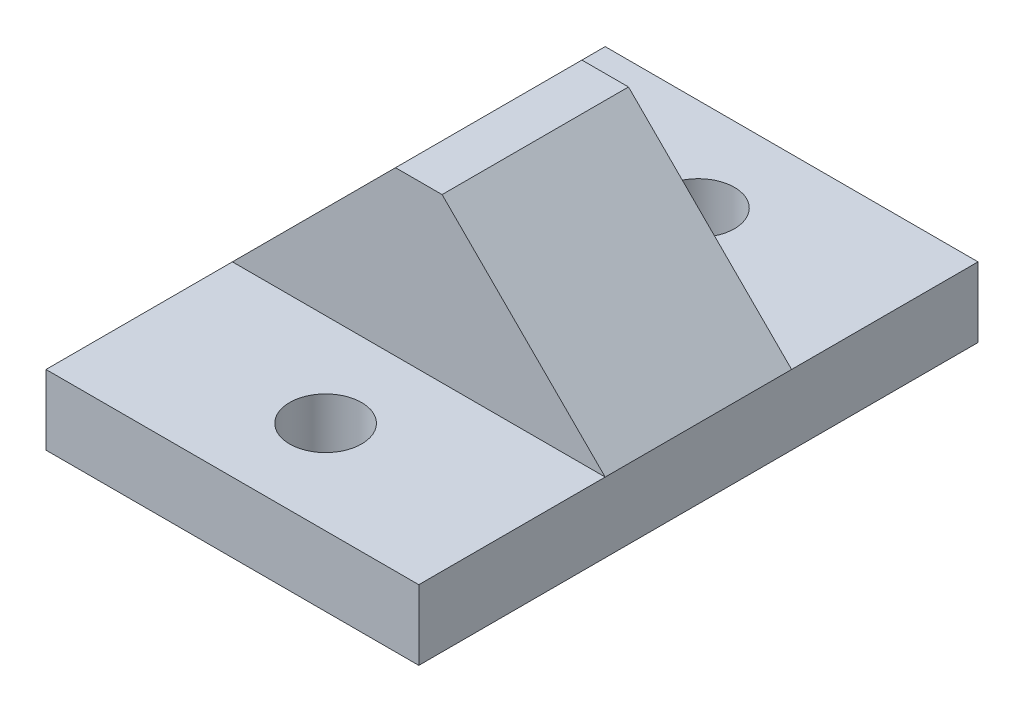
ISO-10303-21;
HEADER;
FILE_DESCRIPTION(('STEP AP214'),'2;1');
FILE_NAME('part.step','',(''),(''),'','','');
FILE_SCHEMA(('AUTOMOTIVE_DESIGN { 1 0 10303 214 1 1 1 1 }'));
ENDSEC;
DATA;
#1=APPLICATION_CONTEXT('core data for automotive mechanical design processes');
#2=APPLICATION_PROTOCOL_DEFINITION('international standard','automotive_design',2000,#1);
#3=PRODUCT_CONTEXT('',#1,'mechanical');
#4=PRODUCT('Part','Part','',(#3));
#5=PRODUCT_RELATED_PRODUCT_CATEGORY('part','',(#4));
#6=PRODUCT_DEFINITION_FORMATION('','',#4);
#7=PRODUCT_DEFINITION_CONTEXT('part definition',#1,'design');
#8=PRODUCT_DEFINITION('design','',#6,#7);
#9=PRODUCT_DEFINITION_SHAPE('','',#8);
#10=(LENGTH_UNIT() NAMED_UNIT(*) SI_UNIT(.MILLI.,.METRE.));
#11=(NAMED_UNIT(*) PLANE_ANGLE_UNIT() SI_UNIT($,.RADIAN.));
#12=(NAMED_UNIT(*) SI_UNIT($,.STERADIAN.) SOLID_ANGLE_UNIT());
#13=UNCERTAINTY_MEASURE_WITH_UNIT(LENGTH_MEASURE(1.E-05),#10,'distance_accuracy_value','');
#14=(GEOMETRIC_REPRESENTATION_CONTEXT(3) GLOBAL_UNCERTAINTY_ASSIGNED_CONTEXT((#13)) GLOBAL_UNIT_ASSIGNED_CONTEXT((#10,
#11,#12)) REPRESENTATION_CONTEXT('',''));
#15=CARTESIAN_POINT('',(0.,0.,0.));
#16=DIRECTION('',(0.,0.,1.));
#17=DIRECTION('',(1.,0.,0.));
#18=AXIS2_PLACEMENT_3D('',#15,#16,#17);
#19=CARTESIAN_POINT('',(0.,0.,-38.1));
#20=DIRECTION('',(0.,0.,1.));
#21=DIRECTION('',(1.,0.,0.));
#22=AXIS2_PLACEMENT_3D('',#19,#20,#21);
#23=PLANE('',#22);
#24=DIRECTION('',(1.,0.,0.));
#25=VECTOR('',#24,1.);
#26=CARTESIAN_POINT('',(-25.4,9.52499999999993,-38.1));
#27=LINE('',#26,#25);
#28=CARTESIAN_POINT('',(-25.4,9.52499999999993,-38.1));
#29=VERTEX_POINT('',#28);
#30=CARTESIAN_POINT('',(25.4,9.52499999999993,-38.1));
#31=VERTEX_POINT('',#30);
#32=EDGE_CURVE('E127',#29,#31,#27,.T.);
#33=ORIENTED_EDGE('',*,*,#32,.T.);
#34=DIRECTION('',(0.,1.,0.));
#35=VECTOR('',#34,1.);
#36=CARTESIAN_POINT('',(25.4,0.,-38.1));
#37=LINE('',#36,#35);
#38=CARTESIAN_POINT('',(25.4,0.,-38.1));
#39=VERTEX_POINT('',#38);
#40=EDGE_CURVE('E167',#39,#31,#37,.T.);
#41=ORIENTED_EDGE('',*,*,#40,.F.);
#42=DIRECTION('',(1.,0.,0.));
#43=VECTOR('',#42,1.);
#44=CARTESIAN_POINT('',(0.,0.,-38.1));
#45=LINE('',#44,#43);
#46=CARTESIAN_POINT('',(-25.4,0.,-38.1));
#47=VERTEX_POINT('',#46);
#48=EDGE_CURVE('E79',#47,#39,#45,.T.);
#49=ORIENTED_EDGE('',*,*,#48,.F.);
#50=DIRECTION('',(0.,-1.,0.));
#51=VECTOR('',#50,1.);
#52=CARTESIAN_POINT('',(-25.4,9.52499999999993,-38.1));
#53=LINE('',#52,#51);
#54=EDGE_CURVE('E191',#29,#47,#53,.T.);
#55=ORIENTED_EDGE('',*,*,#54,.F.);
#56=EDGE_LOOP('',(#33,#41,#49,#55));
#57=FACE_BOUND('',#56,.T.);
#58=ADVANCED_FACE('F40',(#57),#23,.F.);
#59=CARTESIAN_POINT('',(0.,0.,38.1));
#60=DIRECTION('',(0.,1.,0.));
#61=DIRECTION('',(0.,0.,1.));
#62=AXIS2_PLACEMENT_3D('',#59,#60,#61);
#63=PLANE('',#62);
#64=CARTESIAN_POINT('',(0.,0.,-25.4));
#65=DIRECTION('',(0.,1.,0.));
#66=DIRECTION('',(0.,0.,1.));
#67=AXIS2_PLACEMENT_3D('',#64,#65,#66);
#68=CIRCLE('',#67,4.9022);
#69=CARTESIAN_POINT('',(0.,0.,-20.4978));
#70=VERTEX_POINT('',#69);
#71=EDGE_CURVE('E203',#70,#70,#68,.T.);
#72=ORIENTED_EDGE('',*,*,#71,.T.);
#73=EDGE_LOOP('',(#72));
#74=FACE_BOUND('',#73,.T.);
#75=CARTESIAN_POINT('',(0.,0.,25.4));
#76=DIRECTION('',(0.,1.,0.));
#77=DIRECTION('',(0.,0.,1.));
#78=AXIS2_PLACEMENT_3D('',#75,#76,#77);
#79=CIRCLE('',#78,4.9022);
#80=CARTESIAN_POINT('',(0.,0.,30.3022));
#81=VERTEX_POINT('',#80);
#82=EDGE_CURVE('E178',#81,#81,#79,.T.);
#83=ORIENTED_EDGE('',*,*,#82,.T.);
#84=EDGE_LOOP('',(#83));
#85=FACE_BOUND('',#84,.T.);
#86=ORIENTED_EDGE('',*,*,#48,.T.);
#87=DIRECTION('',(0.,0.,-1.));
#88=VECTOR('',#87,1.);
#89=CARTESIAN_POINT('',(25.4,0.,38.1));
#90=LINE('',#89,#88);
#91=CARTESIAN_POINT('',(25.4,0.,38.1));
#92=VERTEX_POINT('',#91);
#93=EDGE_CURVE('E11',#92,#39,#90,.T.);
#94=ORIENTED_EDGE('',*,*,#93,.F.);
#95=DIRECTION('',(1.,0.,0.));
#96=VECTOR('',#95,1.);
#97=CARTESIAN_POINT('',(-25.4,0.,38.1));
#98=LINE('',#97,#96);
#99=CARTESIAN_POINT('',(-25.4,0.,38.1));
#100=VERTEX_POINT('',#99);
#101=EDGE_CURVE('E83',#100,#92,#98,.T.);
#102=ORIENTED_EDGE('',*,*,#101,.F.);
#103=DIRECTION('',(0.,0.,-1.));
#104=VECTOR('',#103,1.);
#105=CARTESIAN_POINT('',(-25.4,0.,38.1));
#106=LINE('',#105,#104);
#107=EDGE_CURVE('E194',#100,#47,#106,.T.);
#108=ORIENTED_EDGE('',*,*,#107,.T.);
#109=EDGE_LOOP('',(#86,#94,#102,#108));
#110=FACE_BOUND('',#109,.T.);
#111=ADVANCED_FACE('F42',(#74,#85,#110),#63,.F.);
#112=CARTESIAN_POINT('',(25.4,0.,38.1));
#113=DIRECTION('',(-1.,0.,0.));
#114=DIRECTION('',(0.,0.,1.));
#115=AXIS2_PLACEMENT_3D('',#112,#113,#114);
#116=PLANE('',#115);
#117=ORIENTED_EDGE('',*,*,#40,.T.);
#118=DIRECTION('',(0.,0.,-1.));
#119=VECTOR('',#118,1.);
#120=CARTESIAN_POINT('',(25.4,9.52499999999993,-12.7));
#121=LINE('',#120,#119);
#122=CARTESIAN_POINT('',(25.4,9.52499999999993,-12.7));
#123=VERTEX_POINT('',#122);
#124=EDGE_CURVE('E73',#123,#31,#121,.T.);
#125=ORIENTED_EDGE('',*,*,#124,.F.);
#126=DIRECTION('',(0.,0.,-1.));
#127=VECTOR('',#126,1.);
#128=CARTESIAN_POINT('',(25.4,9.52499999999993,38.1));
#129=LINE('',#128,#127);
#130=CARTESIAN_POINT('',(25.4,9.52499999999993,12.7));
#131=VERTEX_POINT('',#130);
#132=EDGE_CURVE('E148',#131,#123,#129,.T.);
#133=ORIENTED_EDGE('',*,*,#132,.F.);
#134=CARTESIAN_POINT('',(25.4,9.52499999999993,38.1));
#135=VERTEX_POINT('',#134);
#136=EDGE_CURVE('E49',#135,#131,#129,.T.);
#137=ORIENTED_EDGE('',*,*,#136,.F.);
#138=DIRECTION('',(0.,1.,0.));
#139=VECTOR('',#138,1.);
#140=CARTESIAN_POINT('',(25.4,0.,38.1));
#141=LINE('',#140,#139);
#142=EDGE_CURVE('E190',#92,#135,#141,.T.);
#143=ORIENTED_EDGE('',*,*,#142,.F.);
#144=ORIENTED_EDGE('',*,*,#93,.T.);
#145=EDGE_LOOP('',(#117,#125,#133,#137,#143,#144));
#146=FACE_BOUND('',#145,.T.);
#147=ADVANCED_FACE('F165',(#146),#116,.F.);
#148=CARTESIAN_POINT('',(3.175,31.75,38.1));
#149=DIRECTION('',(-0.707106781186549,-0.707106781186546,0.));
#150=DIRECTION('',(0.707106781186546,-0.707106781186549,0.));
#151=AXIS2_PLACEMENT_3D('',#148,#149,#150);
#152=PLANE('',#151);
#153=ORIENTED_EDGE('',*,*,#132,.T.);
#154=DIRECTION('',(-0.707106781186546,0.707106781186549,0.));
#155=VECTOR('',#154,1.);
#156=CARTESIAN_POINT('',(25.4,9.52499999999993,-12.7));
#157=LINE('',#156,#155);
#158=CARTESIAN_POINT('',(3.175,31.75,-12.7));
#159=VERTEX_POINT('',#158);
#160=EDGE_CURVE('E137',#123,#159,#157,.T.);
#161=ORIENTED_EDGE('',*,*,#160,.T.);
#162=DIRECTION('',(0.,0.,-1.));
#163=VECTOR('',#162,1.);
#164=CARTESIAN_POINT('',(3.175,31.75,38.1));
#165=LINE('',#164,#163);
#166=CARTESIAN_POINT('',(3.175,31.75,12.7));
#167=VERTEX_POINT('',#166);
#168=EDGE_CURVE('E136',#167,#159,#165,.T.);
#169=ORIENTED_EDGE('',*,*,#168,.F.);
#170=DIRECTION('',(-0.707106781186546,0.707106781186549,0.));
#171=VECTOR('',#170,1.);
#172=CARTESIAN_POINT('',(25.4,9.52499999999993,12.7));
#173=LINE('',#172,#171);
#174=EDGE_CURVE('E162',#131,#167,#173,.T.);
#175=ORIENTED_EDGE('',*,*,#174,.F.);
#176=EDGE_LOOP('',(#153,#161,#169,#175));
#177=FACE_BOUND('',#176,.T.);
#178=ADVANCED_FACE('F161',(#177),#152,.F.);
#179=CARTESIAN_POINT('',(-3.175,31.75,38.1));
#180=DIRECTION('',(0.,-1.,0.));
#181=DIRECTION('',(0.,0.,-1.));
#182=AXIS2_PLACEMENT_3D('',#179,#180,#181);
#183=PLANE('',#182);
#184=ORIENTED_EDGE('',*,*,#168,.T.);
#185=DIRECTION('',(-1.,0.,0.));
#186=VECTOR('',#185,1.);
#187=CARTESIAN_POINT('',(3.175,31.75,-12.7));
#188=LINE('',#187,#186);
#189=CARTESIAN_POINT('',(-3.175,31.75,-12.7));
#190=VERTEX_POINT('',#189);
#191=EDGE_CURVE('E119',#159,#190,#188,.T.);
#192=ORIENTED_EDGE('',*,*,#191,.T.);
#193=DIRECTION('',(0.,0.,-1.));
#194=VECTOR('',#193,1.);
#195=CARTESIAN_POINT('',(-3.175,31.75,38.1));
#196=LINE('',#195,#194);
#197=CARTESIAN_POINT('',(-3.175,31.75,12.7));
#198=VERTEX_POINT('',#197);
#199=EDGE_CURVE('E134',#198,#190,#196,.T.);
#200=ORIENTED_EDGE('',*,*,#199,.F.);
#201=DIRECTION('',(-1.,0.,0.));
#202=VECTOR('',#201,1.);
#203=CARTESIAN_POINT('',(3.175,31.75,12.7));
#204=LINE('',#203,#202);
#205=EDGE_CURVE('E186',#167,#198,#204,.T.);
#206=ORIENTED_EDGE('',*,*,#205,.F.);
#207=EDGE_LOOP('',(#184,#192,#200,#206));
#208=FACE_BOUND('',#207,.T.);
#209=ADVANCED_FACE('F132',(#208),#183,.F.);
#210=CARTESIAN_POINT('',(-25.4,9.52499999999993,38.1));
#211=DIRECTION('',(0.707106781186549,-0.707106781186546,0.));
#212=DIRECTION('',(0.707106781186546,0.707106781186549,0.));
#213=AXIS2_PLACEMENT_3D('',#210,#211,#212);
#214=PLANE('',#213);
#215=ORIENTED_EDGE('',*,*,#199,.T.);
#216=DIRECTION('',(-0.707106781186546,-0.707106781186549,0.));
#217=VECTOR('',#216,1.);
#218=CARTESIAN_POINT('',(-3.175,31.75,-12.7));
#219=LINE('',#218,#217);
#220=CARTESIAN_POINT('',(-25.4,9.52499999999993,-12.7));
#221=VERTEX_POINT('',#220);
#222=EDGE_CURVE('E115',#190,#221,#219,.T.);
#223=ORIENTED_EDGE('',*,*,#222,.T.);
#224=DIRECTION('',(0.,0.,-1.));
#225=VECTOR('',#224,1.);
#226=CARTESIAN_POINT('',(-25.4,9.52499999999993,38.1));
#227=LINE('',#226,#225);
#228=CARTESIAN_POINT('',(-25.4,9.52499999999993,12.7));
#229=VERTEX_POINT('',#228);
#230=EDGE_CURVE('E151',#229,#221,#227,.T.);
#231=ORIENTED_EDGE('',*,*,#230,.F.);
#232=DIRECTION('',(-0.707106781186546,-0.707106781186549,0.));
#233=VECTOR('',#232,1.);
#234=CARTESIAN_POINT('',(-3.175,31.75,12.7));
#235=LINE('',#234,#233);
#236=EDGE_CURVE('E142',#198,#229,#235,.T.);
#237=ORIENTED_EDGE('',*,*,#236,.F.);
#238=EDGE_LOOP('',(#215,#223,#231,#237));
#239=FACE_BOUND('',#238,.T.);
#240=ADVANCED_FACE('F140',(#239),#214,.F.);
#241=CARTESIAN_POINT('',(-25.4,9.52499999999993,38.1));
#242=DIRECTION('',(1.,0.,0.));
#243=DIRECTION('',(0.,1.,0.));
#244=AXIS2_PLACEMENT_3D('',#241,#242,#243);
#245=PLANE('',#244);
#246=ORIENTED_EDGE('',*,*,#54,.T.);
#247=ORIENTED_EDGE('',*,*,#107,.F.);
#248=DIRECTION('',(0.,-1.,0.));
#249=VECTOR('',#248,1.);
#250=CARTESIAN_POINT('',(-25.4,9.52499999999993,38.1));
#251=LINE('',#250,#249);
#252=CARTESIAN_POINT('',(-25.4,9.52499999999993,38.1));
#253=VERTEX_POINT('',#252);
#254=EDGE_CURVE('E57',#253,#100,#251,.T.);
#255=ORIENTED_EDGE('',*,*,#254,.F.);
#256=EDGE_CURVE('E144',#253,#229,#227,.T.);
#257=ORIENTED_EDGE('',*,*,#256,.T.);
#258=ORIENTED_EDGE('',*,*,#230,.T.);
#259=DIRECTION('',(0.,0.,-1.));
#260=VECTOR('',#259,1.);
#261=CARTESIAN_POINT('',(-25.4,9.52499999999993,-12.7));
#262=LINE('',#261,#260);
#263=EDGE_CURVE('E168',#221,#29,#262,.T.);
#264=ORIENTED_EDGE('',*,*,#263,.T.);
#265=EDGE_LOOP('',(#246,#247,#255,#257,#258,#264));
#266=FACE_BOUND('',#265,.T.);
#267=ADVANCED_FACE('F200',(#266),#245,.F.);
#268=CARTESIAN_POINT('',(0.,0.,38.1));
#269=DIRECTION('',(0.,0.,1.));
#270=DIRECTION('',(1.,0.,0.));
#271=AXIS2_PLACEMENT_3D('',#268,#269,#270);
#272=PLANE('',#271);
#273=DIRECTION('',(1.,0.,0.));
#274=VECTOR('',#273,1.);
#275=CARTESIAN_POINT('',(-25.4,9.52499999999993,38.1));
#276=LINE('',#275,#274);
#277=EDGE_CURVE('E181',#253,#135,#276,.T.);
#278=ORIENTED_EDGE('',*,*,#277,.F.);
#279=ORIENTED_EDGE('',*,*,#254,.T.);
#280=ORIENTED_EDGE('',*,*,#101,.T.);
#281=ORIENTED_EDGE('',*,*,#142,.T.);
#282=EDGE_LOOP('',(#278,#279,#280,#281));
#283=FACE_BOUND('',#282,.T.);
#284=ADVANCED_FACE('F202',(#283),#272,.T.);
#285=CARTESIAN_POINT('',(-25.4,9.52499999999993,12.7));
#286=DIRECTION('',(0.,-1.,0.));
#287=DIRECTION('',(0.,0.,-1.));
#288=AXIS2_PLACEMENT_3D('',#285,#286,#287);
#289=PLANE('',#288);
#290=CARTESIAN_POINT('',(0.,9.52499999999993,25.4));
#291=DIRECTION('',(0.,1.,0.));
#292=DIRECTION('',(0.,0.,1.));
#293=AXIS2_PLACEMENT_3D('',#290,#291,#292);
#294=CIRCLE('',#293,4.90219999999999);
#295=CARTESIAN_POINT('',(0.,9.52499999999993,30.3022));
#296=VERTEX_POINT('',#295);
#297=EDGE_CURVE('E171',#296,#296,#294,.T.);
#298=ORIENTED_EDGE('',*,*,#297,.F.);
#299=EDGE_LOOP('',(#298));
#300=FACE_BOUND('',#299,.T.);
#301=ORIENTED_EDGE('',*,*,#277,.T.);
#302=ORIENTED_EDGE('',*,*,#136,.T.);
#303=DIRECTION('',(1.,0.,0.));
#304=VECTOR('',#303,1.);
#305=CARTESIAN_POINT('',(-25.4,9.52499999999993,12.7));
#306=LINE('',#305,#304);
#307=EDGE_CURVE('E183',#229,#131,#306,.T.);
#308=ORIENTED_EDGE('',*,*,#307,.F.);
#309=ORIENTED_EDGE('',*,*,#256,.F.);
#310=EDGE_LOOP('',(#301,#302,#308,#309));
#311=FACE_BOUND('',#310,.T.);
#312=ADVANCED_FACE('F201',(#300,#311),#289,.F.);
#313=CARTESIAN_POINT('',(0.,0.,12.7));
#314=DIRECTION('',(0.,0.,-1.));
#315=DIRECTION('',(-1.,0.,0.));
#316=AXIS2_PLACEMENT_3D('',#313,#314,#315);
#317=PLANE('',#316);
#318=ORIENTED_EDGE('',*,*,#236,.T.);
#319=ORIENTED_EDGE('',*,*,#307,.T.);
#320=ORIENTED_EDGE('',*,*,#174,.T.);
#321=ORIENTED_EDGE('',*,*,#205,.T.);
#322=EDGE_LOOP('',(#318,#319,#320,#321));
#323=FACE_BOUND('',#322,.T.);
#324=ADVANCED_FACE('F223',(#323),#317,.F.);
#325=CARTESIAN_POINT('',(0.,9.52499999999993,25.4));
#326=DIRECTION('',(0.,1.,0.));
#327=DIRECTION('',(0.,0.,1.));
#328=AXIS2_PLACEMENT_3D('',#325,#326,#327);
#329=CYLINDRICAL_SURFACE('',#328,4.90219999999999);
#330=ORIENTED_EDGE('',*,*,#82,.F.);
#331=EDGE_LOOP('',(#330));
#332=FACE_BOUND('',#331,.T.);
#333=ORIENTED_EDGE('',*,*,#297,.T.);
#334=EDGE_LOOP('',(#333));
#335=FACE_BOUND('',#334,.T.);
#336=ADVANCED_FACE('F216',(#332,#335),#329,.F.);
#337=CARTESIAN_POINT('',(-25.4,9.52499999999993,-12.7));
#338=DIRECTION('',(0.,1.,0.));
#339=DIRECTION('',(0.,0.,1.));
#340=AXIS2_PLACEMENT_3D('',#337,#338,#339);
#341=PLANE('',#340);
#342=CARTESIAN_POINT('',(0.,9.52499999999993,-25.4));
#343=DIRECTION('',(0.,1.,0.));
#344=DIRECTION('',(0.,0.,1.));
#345=AXIS2_PLACEMENT_3D('',#342,#343,#344);
#346=CIRCLE('',#345,4.90219999999999);
#347=CARTESIAN_POINT('',(0.,9.52499999999993,-20.4978));
#348=VERTEX_POINT('',#347);
#349=EDGE_CURVE('E205',#348,#348,#346,.T.);
#350=ORIENTED_EDGE('',*,*,#349,.F.);
#351=EDGE_LOOP('',(#350));
#352=FACE_BOUND('',#351,.T.);
#353=ORIENTED_EDGE('',*,*,#32,.F.);
#354=ORIENTED_EDGE('',*,*,#263,.F.);
#355=DIRECTION('',(1.,0.,0.));
#356=VECTOR('',#355,1.);
#357=CARTESIAN_POINT('',(-25.4,9.52499999999993,-12.7));
#358=LINE('',#357,#356);
#359=EDGE_CURVE('E121',#221,#123,#358,.T.);
#360=ORIENTED_EDGE('',*,*,#359,.T.);
#361=ORIENTED_EDGE('',*,*,#124,.T.);
#362=EDGE_LOOP('',(#353,#354,#360,#361));
#363=FACE_BOUND('',#362,.T.);
#364=ADVANCED_FACE('F214',(#352,#363),#341,.T.);
#365=CARTESIAN_POINT('',(0.,0.,-12.7));
#366=DIRECTION('',(0.,0.,1.));
#367=DIRECTION('',(-1.,0.,0.));
#368=AXIS2_PLACEMENT_3D('',#365,#366,#367);
#369=PLANE('',#368);
#370=ORIENTED_EDGE('',*,*,#222,.F.);
#371=ORIENTED_EDGE('',*,*,#191,.F.);
#372=ORIENTED_EDGE('',*,*,#160,.F.);
#373=ORIENTED_EDGE('',*,*,#359,.F.);
#374=EDGE_LOOP('',(#370,#371,#372,#373));
#375=FACE_BOUND('',#374,.T.);
#376=ADVANCED_FACE('F117',(#375),#369,.F.);
#377=CARTESIAN_POINT('',(0.,9.52499999999993,-25.4));
#378=DIRECTION('',(0.,1.,0.));
#379=DIRECTION('',(0.,0.,1.));
#380=AXIS2_PLACEMENT_3D('',#377,#378,#379);
#381=CYLINDRICAL_SURFACE('',#380,4.90219999999999);
#382=ORIENTED_EDGE('',*,*,#71,.F.);
#383=EDGE_LOOP('',(#382));
#384=FACE_BOUND('',#383,.T.);
#385=ORIENTED_EDGE('',*,*,#349,.T.);
#386=EDGE_LOOP('',(#385));
#387=FACE_BOUND('',#386,.T.);
#388=ADVANCED_FACE('F212',(#384,#387),#381,.F.);
#389=CLOSED_SHELL('',(#58,#111,#147,#178,#209,#240,#267,#284,#312,#324,#336,#364,#376,#388));
#390=MANIFOLD_SOLID_BREP('B2',#389);
#391=ADVANCED_BREP_SHAPE_REPRESENTATION('',(#18,#390),#14);
#392=SHAPE_DEFINITION_REPRESENTATION(#9,#391);
ENDSEC;
END-ISO-10303-21;
